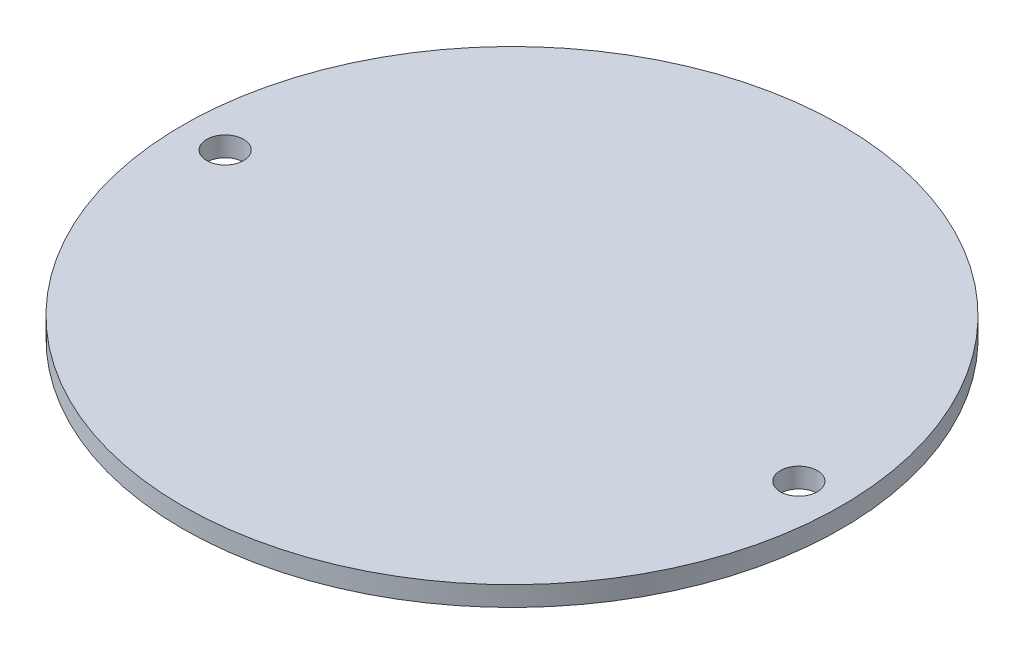
ISO-10303-21;
HEADER;
FILE_DESCRIPTION(('STEP AP214'),'2;1');
FILE_NAME('part.step','',(''),(''),'','','');
FILE_SCHEMA(('AUTOMOTIVE_DESIGN { 1 0 10303 214 1 1 1 1 }'));
ENDSEC;
DATA;
#1=APPLICATION_CONTEXT('core data for automotive mechanical design processes');
#2=APPLICATION_PROTOCOL_DEFINITION('international standard','automotive_design',2000,#1);
#3=PRODUCT_CONTEXT('',#1,'mechanical');
#4=PRODUCT('Part','Part','',(#3));
#5=PRODUCT_RELATED_PRODUCT_CATEGORY('part','',(#4));
#6=PRODUCT_DEFINITION_FORMATION('','',#4);
#7=PRODUCT_DEFINITION_CONTEXT('part definition',#1,'design');
#8=PRODUCT_DEFINITION('design','',#6,#7);
#9=PRODUCT_DEFINITION_SHAPE('','',#8);
#10=(LENGTH_UNIT() NAMED_UNIT(*) SI_UNIT(.MILLI.,.METRE.));
#11=(NAMED_UNIT(*) PLANE_ANGLE_UNIT() SI_UNIT($,.RADIAN.));
#12=(NAMED_UNIT(*) SI_UNIT($,.STERADIAN.) SOLID_ANGLE_UNIT());
#13=UNCERTAINTY_MEASURE_WITH_UNIT(LENGTH_MEASURE(1.E-05),#10,'distance_accuracy_value','');
#14=(GEOMETRIC_REPRESENTATION_CONTEXT(3) GLOBAL_UNCERTAINTY_ASSIGNED_CONTEXT((#13)) GLOBAL_UNIT_ASSIGNED_CONTEXT((#10,
#11,#12)) REPRESENTATION_CONTEXT('',''));
#15=CARTESIAN_POINT('',(0.,0.,0.));
#16=DIRECTION('',(0.,0.,1.));
#17=DIRECTION('',(1.,0.,0.));
#18=AXIS2_PLACEMENT_3D('',#15,#16,#17);
#19=CARTESIAN_POINT('',(0.,3.75,0.));
#20=DIRECTION('',(0.,-1.,0.));
#21=DIRECTION('',(0.,0.,-1.));
#22=AXIS2_PLACEMENT_3D('',#19,#20,#21);
#23=CYLINDRICAL_SURFACE('',#22,62.5);
#24=CARTESIAN_POINT('',(0.,3.75,0.));
#25=DIRECTION('',(0.,1.,0.));
#26=DIRECTION('',(0.,0.,1.));
#27=AXIS2_PLACEMENT_3D('',#24,#25,#26);
#28=CIRCLE('',#27,62.5);
#29=CARTESIAN_POINT('',(0.,3.75,62.5));
#30=VERTEX_POINT('',#29);
#31=EDGE_CURVE('E10',#30,#30,#28,.T.);
#32=ORIENTED_EDGE('',*,*,#31,.F.);
#33=EDGE_LOOP('',(#32));
#34=FACE_BOUND('',#33,.T.);
#35=CARTESIAN_POINT('',(0.,0.,0.));
#36=DIRECTION('',(0.,1.,0.));
#37=DIRECTION('',(0.,0.,1.));
#38=AXIS2_PLACEMENT_3D('',#35,#36,#37);
#39=CIRCLE('',#38,62.5);
#40=CARTESIAN_POINT('',(0.,0.,62.5));
#41=VERTEX_POINT('',#40);
#42=EDGE_CURVE('E37',#41,#41,#39,.T.);
#43=ORIENTED_EDGE('',*,*,#42,.T.);
#44=EDGE_LOOP('',(#43));
#45=FACE_BOUND('',#44,.T.);
#46=ADVANCED_FACE('F34',(#34,#45),#23,.T.);
#47=CARTESIAN_POINT('',(0.,3.75,0.));
#48=DIRECTION('',(0.,1.,0.));
#49=DIRECTION('',(0.,0.,1.));
#50=AXIS2_PLACEMENT_3D('',#47,#48,#49);
#51=PLANE('',#50);
#52=CARTESIAN_POINT('',(54.4,3.75,0.));
#53=DIRECTION('',(0.,1.,0.));
#54=DIRECTION('',(0.,0.,1.));
#55=AXIS2_PLACEMENT_3D('',#52,#53,#54);
#56=CIRCLE('',#55,3.49999999999999);
#57=CARTESIAN_POINT('',(54.4,3.75,3.49999999999999));
#58=VERTEX_POINT('',#57);
#59=EDGE_CURVE('E54',#58,#58,#56,.T.);
#60=ORIENTED_EDGE('',*,*,#59,.F.);
#61=EDGE_LOOP('',(#60));
#62=FACE_BOUND('',#61,.T.);
#63=CARTESIAN_POINT('',(-54.4,3.75,0.));
#64=DIRECTION('',(0.,1.,0.));
#65=DIRECTION('',(0.,0.,1.));
#66=AXIS2_PLACEMENT_3D('',#63,#64,#65);
#67=CIRCLE('',#66,3.49999999999999);
#68=CARTESIAN_POINT('',(-54.4,3.75,3.49999999999999));
#69=VERTEX_POINT('',#68);
#70=EDGE_CURVE('E48',#69,#69,#67,.T.);
#71=ORIENTED_EDGE('',*,*,#70,.F.);
#72=EDGE_LOOP('',(#71));
#73=FACE_BOUND('',#72,.T.);
#74=ORIENTED_EDGE('',*,*,#31,.T.);
#75=EDGE_LOOP('',(#74));
#76=FACE_BOUND('',#75,.T.);
#77=ADVANCED_FACE('F60',(#62,#73,#76),#51,.T.);
#78=CARTESIAN_POINT('',(0.,0.,0.));
#79=DIRECTION('',(0.,1.,0.));
#80=DIRECTION('',(0.,0.,1.));
#81=AXIS2_PLACEMENT_3D('',#78,#79,#80);
#82=PLANE('',#81);
#83=CARTESIAN_POINT('',(54.4,0.,0.));
#84=DIRECTION('',(0.,1.,0.));
#85=DIRECTION('',(0.,0.,1.));
#86=AXIS2_PLACEMENT_3D('',#83,#84,#85);
#87=CIRCLE('',#86,3.5);
#88=CARTESIAN_POINT('',(54.4,0.,3.5));
#89=VERTEX_POINT('',#88);
#90=EDGE_CURVE('E51',#89,#89,#87,.T.);
#91=ORIENTED_EDGE('',*,*,#90,.T.);
#92=EDGE_LOOP('',(#91));
#93=FACE_BOUND('',#92,.T.);
#94=CARTESIAN_POINT('',(-54.4,0.,0.));
#95=DIRECTION('',(0.,1.,0.));
#96=DIRECTION('',(0.,0.,1.));
#97=AXIS2_PLACEMENT_3D('',#94,#95,#96);
#98=CIRCLE('',#97,3.5);
#99=CARTESIAN_POINT('',(-54.4,0.,3.5));
#100=VERTEX_POINT('',#99);
#101=EDGE_CURVE('E44',#100,#100,#98,.T.);
#102=ORIENTED_EDGE('',*,*,#101,.T.);
#103=EDGE_LOOP('',(#102));
#104=FACE_BOUND('',#103,.T.);
#105=ORIENTED_EDGE('',*,*,#42,.F.);
#106=EDGE_LOOP('',(#105));
#107=FACE_BOUND('',#106,.T.);
#108=ADVANCED_FACE('F63',(#93,#104,#107),#82,.F.);
#109=CARTESIAN_POINT('',(-54.4,3.75,0.));
#110=DIRECTION('',(0.,1.,0.));
#111=DIRECTION('',(0.,0.,1.));
#112=AXIS2_PLACEMENT_3D('',#109,#110,#111);
#113=CYLINDRICAL_SURFACE('',#112,3.49999999999999);
#114=ORIENTED_EDGE('',*,*,#101,.F.);
#115=EDGE_LOOP('',(#114));
#116=FACE_BOUND('',#115,.T.);
#117=ORIENTED_EDGE('',*,*,#70,.T.);
#118=EDGE_LOOP('',(#117));
#119=FACE_BOUND('',#118,.T.);
#120=ADVANCED_FACE('F67',(#116,#119),#113,.F.);
#121=CARTESIAN_POINT('',(54.4,3.75,0.));
#122=DIRECTION('',(0.,1.,0.));
#123=DIRECTION('',(0.,0.,1.));
#124=AXIS2_PLACEMENT_3D('',#121,#122,#123);
#125=CYLINDRICAL_SURFACE('',#124,3.49999999999999);
#126=ORIENTED_EDGE('',*,*,#90,.F.);
#127=EDGE_LOOP('',(#126));
#128=FACE_BOUND('',#127,.T.);
#129=ORIENTED_EDGE('',*,*,#59,.T.);
#130=EDGE_LOOP('',(#129));
#131=FACE_BOUND('',#130,.T.);
#132=ADVANCED_FACE('F58',(#128,#131),#125,.F.);
#133=CLOSED_SHELL('',(#46,#77,#108,#120,#132));
#134=MANIFOLD_SOLID_BREP('B2',#133);
#135=ADVANCED_BREP_SHAPE_REPRESENTATION('',(#18,#134),#14);
#136=SHAPE_DEFINITION_REPRESENTATION(#9,#135);
ENDSEC;
END-ISO-10303-21;
